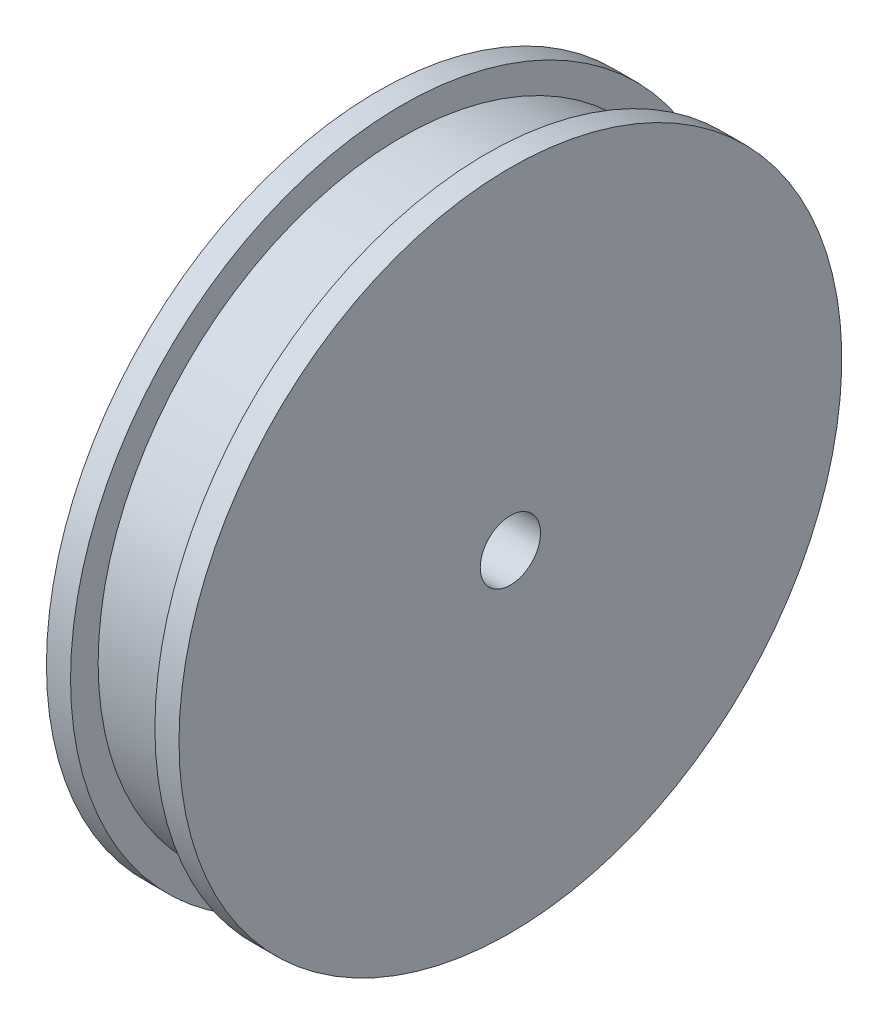
ISO-10303-21;
HEADER;
FILE_DESCRIPTION(('STEP AP214'),'2;1');
FILE_NAME('part.step','',(''),(''),'','','');
FILE_SCHEMA(('AUTOMOTIVE_DESIGN { 1 0 10303 214 1 1 1 1 }'));
ENDSEC;
DATA;
#1=APPLICATION_CONTEXT('core data for automotive mechanical design processes');
#2=APPLICATION_PROTOCOL_DEFINITION('international standard','automotive_design',2000,#1);
#3=PRODUCT_CONTEXT('',#1,'mechanical');
#4=PRODUCT('Part','Part','',(#3));
#5=PRODUCT_RELATED_PRODUCT_CATEGORY('part','',(#4));
#6=PRODUCT_DEFINITION_FORMATION('','',#4);
#7=PRODUCT_DEFINITION_CONTEXT('part definition',#1,'design');
#8=PRODUCT_DEFINITION('design','',#6,#7);
#9=PRODUCT_DEFINITION_SHAPE('','',#8);
#10=(LENGTH_UNIT() NAMED_UNIT(*) SI_UNIT(.MILLI.,.METRE.));
#11=(NAMED_UNIT(*) PLANE_ANGLE_UNIT() SI_UNIT($,.RADIAN.));
#12=(NAMED_UNIT(*) SI_UNIT($,.STERADIAN.) SOLID_ANGLE_UNIT());
#13=UNCERTAINTY_MEASURE_WITH_UNIT(LENGTH_MEASURE(1.E-05),#10,'distance_accuracy_value','');
#14=(GEOMETRIC_REPRESENTATION_CONTEXT(3) GLOBAL_UNCERTAINTY_ASSIGNED_CONTEXT((#13)) GLOBAL_UNIT_ASSIGNED_CONTEXT((#10,
#11,#12)) REPRESENTATION_CONTEXT('',''));
#15=CARTESIAN_POINT('',(0.,0.,0.));
#16=DIRECTION('',(0.,0.,1.));
#17=DIRECTION('',(1.,0.,0.));
#18=AXIS2_PLACEMENT_3D('',#15,#16,#17);
#19=CARTESIAN_POINT('',(7.,0.,15.));
#20=DIRECTION('',(-1.,0.,0.));
#21=DIRECTION('',(0.,0.,1.));
#22=AXIS2_PLACEMENT_3D('',#19,#20,#21);
#23=PLANE('',#22);
#24=CARTESIAN_POINT('',(7.,0.,0.));
#25=DIRECTION('',(-1.,0.,0.));
#26=DIRECTION('',(0.,0.,1.));
#27=AXIS2_PLACEMENT_3D('',#24,#25,#26);
#28=CIRCLE('',#27,27.5);
#29=CARTESIAN_POINT('',(7.,0.,27.5));
#30=VERTEX_POINT('',#29);
#31=EDGE_CURVE('E10',#30,#30,#28,.T.);
#32=ORIENTED_EDGE('',*,*,#31,.T.);
#33=EDGE_LOOP('',(#32));
#34=FACE_BOUND('',#33,.T.);
#35=CARTESIAN_POINT('',(7.,0.,0.));
#36=DIRECTION('',(-1.,0.,0.));
#37=DIRECTION('',(0.,0.,1.));
#38=AXIS2_PLACEMENT_3D('',#35,#36,#37);
#39=CIRCLE('',#38,15.);
#40=CARTESIAN_POINT('',(7.,0.,15.));
#41=VERTEX_POINT('',#40);
#42=EDGE_CURVE('E80',#41,#41,#39,.T.);
#43=ORIENTED_EDGE('',*,*,#42,.F.);
#44=EDGE_LOOP('',(#43));
#45=FACE_BOUND('',#44,.T.);
#46=ADVANCED_FACE('F37',(#34,#45),#23,.T.);
#47=CARTESIAN_POINT('',(0.,0.,0.));
#48=DIRECTION('',(-1.,0.,0.));
#49=DIRECTION('',(0.,0.,1.));
#50=AXIS2_PLACEMENT_3D('',#47,#48,#49);
#51=CYLINDRICAL_SURFACE('',#50,27.5);
#52=CARTESIAN_POINT('',(9.,0.,0.));
#53=DIRECTION('',(-1.,0.,0.));
#54=DIRECTION('',(0.,0.,1.));
#55=AXIS2_PLACEMENT_3D('',#52,#53,#54);
#56=CIRCLE('',#55,27.5);
#57=CARTESIAN_POINT('',(9.,0.,27.5));
#58=VERTEX_POINT('',#57);
#59=EDGE_CURVE('E44',#58,#58,#56,.T.);
#60=ORIENTED_EDGE('',*,*,#59,.T.);
#61=EDGE_LOOP('',(#60));
#62=FACE_BOUND('',#61,.T.);
#63=ORIENTED_EDGE('',*,*,#31,.F.);
#64=EDGE_LOOP('',(#63));
#65=FACE_BOUND('',#64,.T.);
#66=ADVANCED_FACE('F89',(#62,#65),#51,.T.);
#67=CARTESIAN_POINT('',(9.,0.,27.5));
#68=DIRECTION('',(1.,0.,0.));
#69=DIRECTION('',(0.,0.,-1.));
#70=AXIS2_PLACEMENT_3D('',#67,#68,#69);
#71=PLANE('',#70);
#72=CARTESIAN_POINT('',(9.,0.,0.));
#73=DIRECTION('',(-1.,0.,0.));
#74=DIRECTION('',(0.,0.,1.));
#75=AXIS2_PLACEMENT_3D('',#72,#73,#74);
#76=CIRCLE('',#75,25.21);
#77=CARTESIAN_POINT('',(9.,0.,25.21));
#78=VERTEX_POINT('',#77);
#79=EDGE_CURVE('E49',#78,#78,#76,.T.);
#80=ORIENTED_EDGE('',*,*,#79,.T.);
#81=EDGE_LOOP('',(#80));
#82=FACE_BOUND('',#81,.T.);
#83=ORIENTED_EDGE('',*,*,#59,.F.);
#84=EDGE_LOOP('',(#83));
#85=FACE_BOUND('',#84,.T.);
#86=ADVANCED_FACE('F93',(#82,#85),#71,.T.);
#87=CARTESIAN_POINT('',(0.,0.,0.));
#88=DIRECTION('',(-1.,0.,0.));
#89=DIRECTION('',(0.,0.,1.));
#90=AXIS2_PLACEMENT_3D('',#87,#88,#89);
#91=CYLINDRICAL_SURFACE('',#90,25.21);
#92=CARTESIAN_POINT('',(16.,0.,0.));
#93=DIRECTION('',(-1.,0.,0.));
#94=DIRECTION('',(0.,0.,1.));
#95=AXIS2_PLACEMENT_3D('',#92,#93,#94);
#96=CIRCLE('',#95,25.21);
#97=CARTESIAN_POINT('',(16.,0.,25.21));
#98=VERTEX_POINT('',#97);
#99=EDGE_CURVE('E54',#98,#98,#96,.T.);
#100=ORIENTED_EDGE('',*,*,#99,.T.);
#101=EDGE_LOOP('',(#100));
#102=FACE_BOUND('',#101,.T.);
#103=ORIENTED_EDGE('',*,*,#79,.F.);
#104=EDGE_LOOP('',(#103));
#105=FACE_BOUND('',#104,.T.);
#106=ADVANCED_FACE('F97',(#102,#105),#91,.T.);
#107=CARTESIAN_POINT('',(16.,0.,25.21));
#108=DIRECTION('',(-1.,0.,0.));
#109=DIRECTION('',(0.,0.,1.));
#110=AXIS2_PLACEMENT_3D('',#107,#108,#109);
#111=PLANE('',#110);
#112=CARTESIAN_POINT('',(16.,0.,0.));
#113=DIRECTION('',(-1.,0.,0.));
#114=DIRECTION('',(0.,0.,1.));
#115=AXIS2_PLACEMENT_3D('',#112,#113,#114);
#116=CIRCLE('',#115,27.5);
#117=CARTESIAN_POINT('',(16.,0.,27.5));
#118=VERTEX_POINT('',#117);
#119=EDGE_CURVE('E60',#118,#118,#116,.T.);
#120=ORIENTED_EDGE('',*,*,#119,.T.);
#121=EDGE_LOOP('',(#120));
#122=FACE_BOUND('',#121,.T.);
#123=ORIENTED_EDGE('',*,*,#99,.F.);
#124=EDGE_LOOP('',(#123));
#125=FACE_BOUND('',#124,.T.);
#126=ADVANCED_FACE('F104',(#122,#125),#111,.T.);
#127=CARTESIAN_POINT('',(0.,0.,0.));
#128=DIRECTION('',(-1.,0.,0.));
#129=DIRECTION('',(0.,0.,1.));
#130=AXIS2_PLACEMENT_3D('',#127,#128,#129);
#131=CYLINDRICAL_SURFACE('',#130,27.5);
#132=CARTESIAN_POINT('',(18.,0.,0.));
#133=DIRECTION('',(-1.,0.,0.));
#134=DIRECTION('',(0.,0.,1.));
#135=AXIS2_PLACEMENT_3D('',#132,#133,#134);
#136=CIRCLE('',#135,27.5);
#137=CARTESIAN_POINT('',(18.,0.,27.5));
#138=VERTEX_POINT('',#137);
#139=EDGE_CURVE('E64',#138,#138,#136,.T.);
#140=ORIENTED_EDGE('',*,*,#139,.T.);
#141=EDGE_LOOP('',(#140));
#142=FACE_BOUND('',#141,.T.);
#143=ORIENTED_EDGE('',*,*,#119,.F.);
#144=EDGE_LOOP('',(#143));
#145=FACE_BOUND('',#144,.T.);
#146=ADVANCED_FACE('F108',(#142,#145),#131,.T.);
#147=CARTESIAN_POINT('',(18.,0.,27.5));
#148=DIRECTION('',(1.,0.,0.));
#149=DIRECTION('',(0.,0.,-1.));
#150=AXIS2_PLACEMENT_3D('',#147,#148,#149);
#151=PLANE('',#150);
#152=CARTESIAN_POINT('',(18.,0.,0.));
#153=DIRECTION('',(-1.,0.,0.));
#154=DIRECTION('',(0.,0.,1.));
#155=AXIS2_PLACEMENT_3D('',#152,#153,#154);
#156=CIRCLE('',#155,2.5);
#157=CARTESIAN_POINT('',(18.,0.,2.5));
#158=VERTEX_POINT('',#157);
#159=EDGE_CURVE('E68',#158,#158,#156,.T.);
#160=ORIENTED_EDGE('',*,*,#159,.T.);
#161=EDGE_LOOP('',(#160));
#162=FACE_BOUND('',#161,.T.);
#163=ORIENTED_EDGE('',*,*,#139,.F.);
#164=EDGE_LOOP('',(#163));
#165=FACE_BOUND('',#164,.T.);
#166=ADVANCED_FACE('F112',(#162,#165),#151,.T.);
#167=CARTESIAN_POINT('',(0.,0.,0.));
#168=DIRECTION('',(-1.,0.,0.));
#169=DIRECTION('',(0.,0.,1.));
#170=AXIS2_PLACEMENT_3D('',#167,#168,#169);
#171=CYLINDRICAL_SURFACE('',#170,2.5);
#172=CARTESIAN_POINT('',(0.,0.,0.));
#173=DIRECTION('',(-1.,0.,0.));
#174=DIRECTION('',(0.,0.,1.));
#175=AXIS2_PLACEMENT_3D('',#172,#173,#174);
#176=CIRCLE('',#175,2.5);
#177=CARTESIAN_POINT('',(0.,0.,2.5));
#178=VERTEX_POINT('',#177);
#179=EDGE_CURVE('E72',#178,#178,#176,.T.);
#180=ORIENTED_EDGE('',*,*,#179,.T.);
#181=EDGE_LOOP('',(#180));
#182=FACE_BOUND('',#181,.T.);
#183=ORIENTED_EDGE('',*,*,#159,.F.);
#184=EDGE_LOOP('',(#183));
#185=FACE_BOUND('',#184,.T.);
#186=ADVANCED_FACE('F116',(#182,#185),#171,.F.);
#187=CARTESIAN_POINT('',(0.,0.,2.5));
#188=DIRECTION('',(-1.,0.,0.));
#189=DIRECTION('',(0.,0.,1.));
#190=AXIS2_PLACEMENT_3D('',#187,#188,#189);
#191=PLANE('',#190);
#192=CARTESIAN_POINT('',(0.,0.,0.));
#193=DIRECTION('',(-1.,0.,0.));
#194=DIRECTION('',(0.,0.,1.));
#195=AXIS2_PLACEMENT_3D('',#192,#193,#194);
#196=CIRCLE('',#195,15.);
#197=CARTESIAN_POINT('',(0.,0.,15.));
#198=VERTEX_POINT('',#197);
#199=EDGE_CURVE('E76',#198,#198,#196,.T.);
#200=ORIENTED_EDGE('',*,*,#199,.T.);
#201=EDGE_LOOP('',(#200));
#202=FACE_BOUND('',#201,.T.);
#203=ORIENTED_EDGE('',*,*,#179,.F.);
#204=EDGE_LOOP('',(#203));
#205=FACE_BOUND('',#204,.T.);
#206=ADVANCED_FACE('F120',(#202,#205),#191,.T.);
#207=CARTESIAN_POINT('',(0.,0.,0.));
#208=DIRECTION('',(-1.,0.,0.));
#209=DIRECTION('',(0.,0.,1.));
#210=AXIS2_PLACEMENT_3D('',#207,#208,#209);
#211=CYLINDRICAL_SURFACE('',#210,15.);
#212=ORIENTED_EDGE('',*,*,#42,.T.);
#213=EDGE_LOOP('',(#212));
#214=FACE_BOUND('',#213,.T.);
#215=ORIENTED_EDGE('',*,*,#199,.F.);
#216=EDGE_LOOP('',(#215));
#217=FACE_BOUND('',#216,.T.);
#218=ADVANCED_FACE('F85',(#214,#217),#211,.T.);
#219=CLOSED_SHELL('',(#46,#66,#86,#106,#126,#146,#166,#186,#206,#218));
#220=MANIFOLD_SOLID_BREP('B2',#219);
#221=ADVANCED_BREP_SHAPE_REPRESENTATION('',(#18,#220),#14);
#222=SHAPE_DEFINITION_REPRESENTATION(#9,#221);
ENDSEC;
END-ISO-10303-21;
